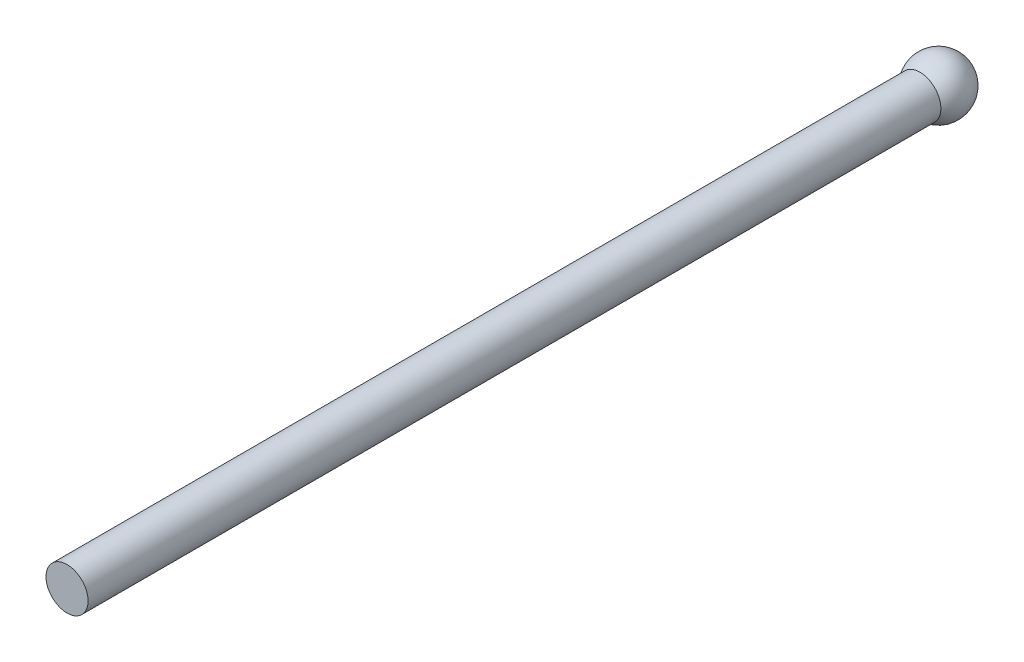
ISO-10303-21;
HEADER;
FILE_DESCRIPTION(('STEP AP214'),'2;1');
FILE_NAME('part.step','',(''),(''),'','','');
FILE_SCHEMA(('AUTOMOTIVE_DESIGN { 1 0 10303 214 1 1 1 1 }'));
ENDSEC;
DATA;
#1=APPLICATION_CONTEXT('core data for automotive mechanical design processes');
#2=APPLICATION_PROTOCOL_DEFINITION('international standard','automotive_design',2000,#1);
#3=PRODUCT_CONTEXT('',#1,'mechanical');
#4=PRODUCT('Part','Part','',(#3));
#5=PRODUCT_RELATED_PRODUCT_CATEGORY('part','',(#4));
#6=PRODUCT_DEFINITION_FORMATION('','',#4);
#7=PRODUCT_DEFINITION_CONTEXT('part definition',#1,'design');
#8=PRODUCT_DEFINITION('design','',#6,#7);
#9=PRODUCT_DEFINITION_SHAPE('','',#8);
#10=(LENGTH_UNIT() NAMED_UNIT(*) SI_UNIT(.MILLI.,.METRE.));
#11=(NAMED_UNIT(*) PLANE_ANGLE_UNIT() SI_UNIT($,.RADIAN.));
#12=(NAMED_UNIT(*) SI_UNIT($,.STERADIAN.) SOLID_ANGLE_UNIT());
#13=UNCERTAINTY_MEASURE_WITH_UNIT(LENGTH_MEASURE(1.E-05),#10,'distance_accuracy_value','');
#14=(GEOMETRIC_REPRESENTATION_CONTEXT(3) GLOBAL_UNCERTAINTY_ASSIGNED_CONTEXT((#13)) GLOBAL_UNIT_ASSIGNED_CONTEXT((#10,
#11,#12)) REPRESENTATION_CONTEXT('',''));
#15=CARTESIAN_POINT('',(0.,0.,0.));
#16=DIRECTION('',(0.,0.,1.));
#17=DIRECTION('',(1.,0.,0.));
#18=AXIS2_PLACEMENT_3D('',#15,#16,#17);
#19=CARTESIAN_POINT('',(0.,0.,310.58));
#20=DIRECTION('',(0.,0.,-1.));
#21=DIRECTION('',(-1.,0.,0.));
#22=AXIS2_PLACEMENT_3D('',#19,#20,#21);
#23=CYLINDRICAL_SURFACE('',#22,7.5);
#24=CARTESIAN_POINT('',(0.,0.,310.58));
#25=DIRECTION('',(0.,0.,1.));
#26=DIRECTION('',(1.,0.,0.));
#27=AXIS2_PLACEMENT_3D('',#24,#25,#26);
#28=CIRCLE('',#27,7.5);
#29=CARTESIAN_POINT('',(7.5,0.,310.58));
#30=VERTEX_POINT('',#29);
#31=EDGE_CURVE('E43',#30,#30,#28,.T.);
#32=ORIENTED_EDGE('',*,*,#31,.F.);
#33=EDGE_LOOP('',(#32));
#34=FACE_BOUND('',#33,.T.);
#35=CARTESIAN_POINT('',(0.,0.,6.61437827766148));
#36=DIRECTION('',(0.,0.,-1.));
#37=DIRECTION('',(-1.,0.,0.));
#38=AXIS2_PLACEMENT_3D('',#35,#36,#37);
#39=CIRCLE('',#38,7.5);
#40=CARTESIAN_POINT('',(-7.5,0.,6.61437827766148));
#41=VERTEX_POINT('',#40);
#42=EDGE_CURVE('E10',#41,#41,#39,.T.);
#43=ORIENTED_EDGE('',*,*,#42,.F.);
#44=EDGE_LOOP('',(#43));
#45=FACE_BOUND('',#44,.T.);
#46=ADVANCED_FACE('F37',(#34,#45),#23,.T.);
#47=CARTESIAN_POINT('',(0.,0.,310.58));
#48=DIRECTION('',(0.,0.,1.));
#49=DIRECTION('',(1.,0.,0.));
#50=AXIS2_PLACEMENT_3D('',#47,#48,#49);
#51=PLANE('',#50);
#52=ORIENTED_EDGE('',*,*,#31,.T.);
#53=EDGE_LOOP('',(#52));
#54=FACE_BOUND('',#53,.T.);
#55=ADVANCED_FACE('F49',(#54),#51,.T.);
#56=CARTESIAN_POINT('',(0.,0.,0.));
#57=DIRECTION('',(0.,0.,1.));
#58=DIRECTION('',(-1.,0.,0.));
#59=AXIS2_PLACEMENT_3D('',#56,#57,#58);
#60=SPHERICAL_SURFACE('',#59,10.);
#61=ORIENTED_EDGE('',*,*,#42,.T.);
#62=EDGE_LOOP('',(#61));
#63=FACE_BOUND('',#62,.T.);
#64=ADVANCED_FACE('F57',(#63),#60,.T.);
#65=CLOSED_SHELL('',(#46,#55,#64));
#66=MANIFOLD_SOLID_BREP('B2',#65);
#67=ADVANCED_BREP_SHAPE_REPRESENTATION('',(#18,#66),#14);
#68=SHAPE_DEFINITION_REPRESENTATION(#9,#67);
ENDSEC;
END-ISO-10303-21;
